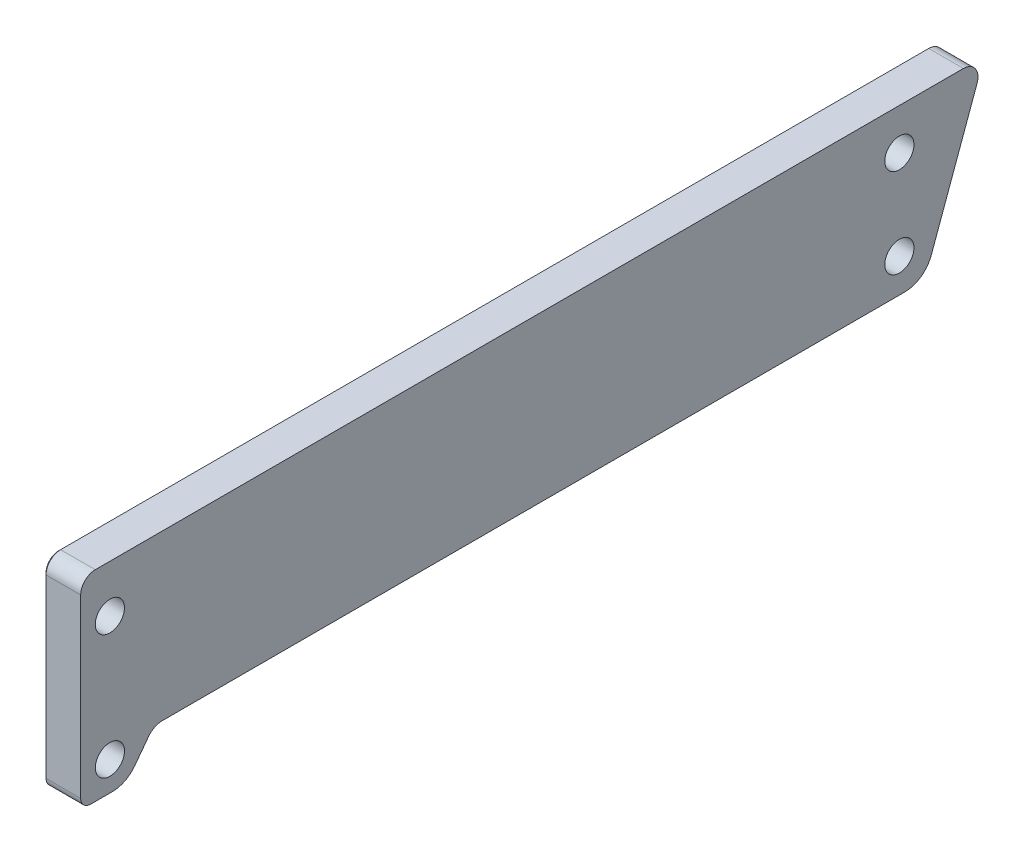
ISO-10303-21;
HEADER;
FILE_DESCRIPTION(('STEP AP214'),'2;1');
FILE_NAME('part.step','',(''),(''),'','','');
FILE_SCHEMA(('AUTOMOTIVE_DESIGN { 1 0 10303 214 1 1 1 1 }'));
ENDSEC;
DATA;
#1=APPLICATION_CONTEXT('core data for automotive mechanical design processes');
#2=APPLICATION_PROTOCOL_DEFINITION('international standard','automotive_design',2000,#1);
#3=PRODUCT_CONTEXT('',#1,'mechanical');
#4=PRODUCT('Part','Part','',(#3));
#5=PRODUCT_RELATED_PRODUCT_CATEGORY('part','',(#4));
#6=PRODUCT_DEFINITION_FORMATION('','',#4);
#7=PRODUCT_DEFINITION_CONTEXT('part definition',#1,'design');
#8=PRODUCT_DEFINITION('design','',#6,#7);
#9=PRODUCT_DEFINITION_SHAPE('','',#8);
#10=(LENGTH_UNIT() NAMED_UNIT(*) SI_UNIT(.MILLI.,.METRE.));
#11=(NAMED_UNIT(*) PLANE_ANGLE_UNIT() SI_UNIT($,.RADIAN.));
#12=(NAMED_UNIT(*) SI_UNIT($,.STERADIAN.) SOLID_ANGLE_UNIT());
#13=UNCERTAINTY_MEASURE_WITH_UNIT(LENGTH_MEASURE(1.E-05),#10,'distance_accuracy_value','');
#14=(GEOMETRIC_REPRESENTATION_CONTEXT(3) GLOBAL_UNCERTAINTY_ASSIGNED_CONTEXT((#13)) GLOBAL_UNIT_ASSIGNED_CONTEXT((#10,
#11,#12)) REPRESENTATION_CONTEXT('',''));
#15=CARTESIAN_POINT('',(0.,0.,0.));
#16=DIRECTION('',(0.,0.,1.));
#17=DIRECTION('',(1.,0.,0.));
#18=AXIS2_PLACEMENT_3D('',#15,#16,#17);
#19=CARTESIAN_POINT('',(2.49567594745314,64.7670130886636,58.028955153829));
#20=DIRECTION('',(-1.,0.,0.));
#21=DIRECTION('',(0.,0.,1.));
#22=AXIS2_PLACEMENT_3D('',#19,#20,#21);
#23=CYLINDRICAL_SURFACE('',#22,2.3);
#24=CARTESIAN_POINT('',(2.49567594745314,64.7670130886636,58.028955153829));
#25=DIRECTION('',(-1.,0.,0.));
#26=DIRECTION('',(0.,0.,1.));
#27=AXIS2_PLACEMENT_3D('',#24,#25,#26);
#28=CIRCLE('',#27,2.3);
#29=CARTESIAN_POINT('',(2.49567594745314,64.7670130886636,60.328955153829));
#30=VERTEX_POINT('',#29);
#31=EDGE_CURVE('E20',#30,#30,#28,.T.);
#32=ORIENTED_EDGE('',*,*,#31,.F.);
#33=EDGE_LOOP('',(#32));
#34=FACE_BOUND('',#33,.T.);
#35=CARTESIAN_POINT('',(1.29567594745314,64.7670130886636,58.028955153829));
#36=DIRECTION('',(-1.,0.,0.));
#37=DIRECTION('',(0.,0.,1.));
#38=AXIS2_PLACEMENT_3D('',#35,#36,#37);
#39=CIRCLE('',#38,2.3);
#40=CARTESIAN_POINT('',(1.29567594745314,64.7670130886636,60.328955153829));
#41=VERTEX_POINT('',#40);
#42=EDGE_CURVE('E119',#41,#41,#39,.F.);
#43=ORIENTED_EDGE('',*,*,#42,.F.);
#44=EDGE_LOOP('',(#43));
#45=FACE_BOUND('',#44,.T.);
#46=ADVANCED_FACE('F17',(#34,#45),#23,.F.);
#47=CARTESIAN_POINT('',(2.49567594745314,64.7670130886636,58.028955153829));
#48=DIRECTION('',(-1.,0.,0.));
#49=DIRECTION('',(0.,0.,1.));
#50=AXIS2_PLACEMENT_3D('',#47,#48,#49);
#51=PLANE('',#50);
#52=CARTESIAN_POINT('',(2.49567594745314,64.7670130886636,58.028955153829));
#53=DIRECTION('',(1.,0.,0.));
#54=DIRECTION('',(0.,0.,-1.));
#55=AXIS2_PLACEMENT_3D('',#52,#53,#54);
#56=CIRCLE('',#55,1.6);
#57=CARTESIAN_POINT('',(2.49567594745314,64.7670130886636,56.428955153829));
#58=VERTEX_POINT('',#57);
#59=EDGE_CURVE('E137',#58,#58,#56,.T.);
#60=ORIENTED_EDGE('',*,*,#59,.T.);
#61=EDGE_LOOP('',(#60));
#62=FACE_BOUND('',#61,.T.);
#63=ORIENTED_EDGE('',*,*,#31,.T.);
#64=EDGE_LOOP('',(#63));
#65=FACE_BOUND('',#64,.T.);
#66=ADVANCED_FACE('F224',(#62,#65),#51,.T.);
#67=CARTESIAN_POINT('',(1.29567594745314,49.3670130886636,138.778955153829));
#68=DIRECTION('',(-1.,0.,0.));
#69=DIRECTION('',(0.,0.,1.));
#70=AXIS2_PLACEMENT_3D('',#67,#68,#69);
#71=PLANE('',#70);
#72=ORIENTED_EDGE('',*,*,#42,.T.);
#73=EDGE_LOOP('',(#72));
#74=FACE_BOUND('',#73,.T.);
#75=CARTESIAN_POINT('',(1.29567594740365,67.6670130886636,146.128955153829));
#76=DIRECTION('',(1.,0.,0.));
#77=DIRECTION('',(0.,0.,-1.));
#78=AXIS2_PLACEMENT_3D('',#75,#76,#77);
#79=CIRCLE('',#78,1.40000000000653);
#80=CARTESIAN_POINT('',(1.29567594743376,69.0670130886442,146.128955153829));
#81=VERTEX_POINT('',#80);
#82=CARTESIAN_POINT('',(1.29567594740365,67.6670130886636,147.528955153837));
#83=VERTEX_POINT('',#82);
#84=EDGE_CURVE('E212',#81,#83,#79,.T.);
#85=ORIENTED_EDGE('',*,*,#84,.F.);
#86=DIRECTION('',(0.,0.,1.));
#87=VECTOR('',#86,1.);
#88=CARTESIAN_POINT('',(1.29567594746387,69.0670130886743,138.778955153829));
#89=LINE('',#88,#87);
#90=CARTESIAN_POINT('',(1.29567594748977,69.0670130886591,51.0139919646164));
#91=VERTEX_POINT('',#90);
#92=EDGE_CURVE('E147',#91,#81,#89,.T.);
#93=ORIENTED_EDGE('',*,*,#92,.F.);
#94=CARTESIAN_POINT('',(1.29567594751734,67.6670130886636,51.0139919646164));
#95=DIRECTION('',(1.,0.,0.));
#96=DIRECTION('',(0.,0.,-1.));
#97=AXIS2_PLACEMENT_3D('',#94,#95,#96);
#98=CIRCLE('',#97,1.40000000000655);
#99=CARTESIAN_POINT('',(1.29567594749468,67.1881848879934,49.6984222954772));
#100=VERTEX_POINT('',#99);
#101=EDGE_CURVE('E210',#100,#91,#98,.T.);
#102=ORIENTED_EDGE('',*,*,#101,.F.);
#103=DIRECTION('',(2.64005216538807E-12,0.939692620785004,-0.342020143328153));
#104=VECTOR('',#103,1.);
#105=CARTESIAN_POINT('',(1.29567594743321,53.3751546730054,54.725954138818));
#106=LINE('',#105,#104);
#107=CARTESIAN_POINT('',(1.29567594744685,53.3751546730095,54.7259541388293));
#108=VERTEX_POINT('',#107);
#109=EDGE_CURVE('E143',#108,#100,#106,.T.);
#110=ORIENTED_EDGE('',*,*,#109,.F.);
#111=CARTESIAN_POINT('',(1.2956759474605,54.3670130886636,57.4510627390708));
#112=DIRECTION('',(1.,0.,0.));
#113=DIRECTION('',(0.,0.,-1.));
#114=AXIS2_PLACEMENT_3D('',#111,#112,#113);
#115=CIRCLE('',#114,2.8999999999559);
#116=CARTESIAN_POINT('',(1.29567594744689,51.4670130886699,57.4510627390709));
#117=VERTEX_POINT('',#116);
#118=EDGE_CURVE('E133',#117,#108,#115,.T.);
#119=ORIENTED_EDGE('',*,*,#118,.F.);
#120=DIRECTION('',(0.,0.,1.));
#121=VECTOR('',#120,1.);
#122=CARTESIAN_POINT('',(1.29567594743328,51.4670130886835,138.778955153829));
#123=LINE('',#122,#121);
#124=CARTESIAN_POINT('',(1.29567594747531,51.4670130886414,138.778955153829));
#125=VERTEX_POINT('',#124);
#126=EDGE_CURVE('E124',#125,#117,#123,.F.);
#127=ORIENTED_EDGE('',*,*,#126,.F.);
#128=CARTESIAN_POINT('',(1.29567594751734,49.3670130886636,138.778955153829));
#129=DIRECTION('',(-1.,0.,0.));
#130=DIRECTION('',(0.,0.,1.));
#131=AXIS2_PLACEMENT_3D('',#128,#129,#130);
#132=CIRCLE('',#131,2.09999999997817);
#133=CARTESIAN_POINT('',(1.29567594748525,50.6270130886853,140.458955153773));
#134=VERTEX_POINT('',#133);
#135=EDGE_CURVE('E107',#125,#134,#132,.F.);
#136=ORIENTED_EDGE('',*,*,#135,.T.);
#137=DIRECTION('',(1.44001130461163E-11,0.799999999991358,-0.600000000011522));
#138=VECTOR('',#137,1.);
#139=CARTESIAN_POINT('',(1.29567594741716,48.6270130886824,141.95895515386));
#140=LINE('',#139,#138);
#141=CARTESIAN_POINT('',(1.29567594742124,48.6270130886686,141.958955153818));
#142=VERTEX_POINT('',#141);
#143=EDGE_CURVE('E160',#142,#134,#140,.T.);
#144=ORIENTED_EDGE('',*,*,#143,.F.);
#145=CARTESIAN_POINT('',(1.29567594751734,50.3670130886636,144.278955153829));
#146=DIRECTION('',(1.,0.,0.));
#147=DIRECTION('',(0.,1.,0.));
#148=AXIS2_PLACEMENT_3D('',#145,#146,#147);
#149=CIRCLE('',#148,2.90000000006141);
#150=CARTESIAN_POINT('',(1.29567594748775,47.467013088629,144.278955153829));
#151=VERTEX_POINT('',#150);
#152=EDGE_CURVE('E216',#151,#142,#149,.T.);
#153=ORIENTED_EDGE('',*,*,#152,.F.);
#154=DIRECTION('',(0.,0.,1.));
#155=VECTOR('',#154,1.);
#156=CARTESIAN_POINT('',(1.29567594745817,47.4670130886586,138.778955153829));
#157=LINE('',#156,#155);
#158=CARTESIAN_POINT('',(1.29567594743149,47.4670130886812,146.628955153829));
#159=VERTEX_POINT('',#158);
#160=EDGE_CURVE('E155',#159,#151,#157,.F.);
#161=ORIENTED_EDGE('',*,*,#160,.F.);
#162=CARTESIAN_POINT('',(1.2956759474605,48.3670130886636,146.628955153829));
#163=DIRECTION('',(1.,0.,0.));
#164=DIRECTION('',(0.,0.,-1.));
#165=AXIS2_PLACEMENT_3D('',#162,#163,#164);
#166=CIRCLE('',#165,0.900000000031376);
#167=CARTESIAN_POINT('',(1.29567594744122,48.3670130886636,147.528955153817));
#168=VERTEX_POINT('',#167);
#169=EDGE_CURVE('E154',#168,#159,#166,.T.);
#170=ORIENTED_EDGE('',*,*,#169,.F.);
#171=DIRECTION('',(0.,1.,0.));
#172=VECTOR('',#171,1.);
#173=CARTESIAN_POINT('',(1.29567594742194,49.3670130886636,147.528955153798));
#174=LINE('',#173,#172);
#175=EDGE_CURVE('E151',#83,#168,#174,.F.);
#176=ORIENTED_EDGE('',*,*,#175,.F.);
#177=EDGE_LOOP('',(#85,#93,#102,#110,#119,#127,#136,#144,#153,#161,#170,#176));
#178=FACE_BOUND('',#177,.T.);
#179=CARTESIAN_POINT('',(1.29567594745314,54.9670130886636,58.028955153829));
#180=DIRECTION('',(1.,0.,0.));
#181=DIRECTION('',(0.,0.,-1.));
#182=AXIS2_PLACEMENT_3D('',#179,#180,#181);
#183=CIRCLE('',#182,1.6);
#184=CARTESIAN_POINT('',(1.29567594745314,54.9670130886636,56.428955153829));
#185=VERTEX_POINT('',#184);
#186=EDGE_CURVE('E204',#185,#185,#183,.T.);
#187=ORIENTED_EDGE('',*,*,#186,.T.);
#188=EDGE_LOOP('',(#187));
#189=FACE_BOUND('',#188,.T.);
#190=CARTESIAN_POINT('',(1.29567594745314,50.4670130886636,144.528955153829));
#191=DIRECTION('',(1.,0.,0.));
#192=DIRECTION('',(0.,0.,-1.));
#193=AXIS2_PLACEMENT_3D('',#190,#191,#192);
#194=CIRCLE('',#193,1.6);
#195=CARTESIAN_POINT('',(1.29567594745314,50.4670130886636,142.928955153829));
#196=VERTEX_POINT('',#195);
#197=EDGE_CURVE('E197',#196,#196,#194,.T.);
#198=ORIENTED_EDGE('',*,*,#197,.T.);
#199=EDGE_LOOP('',(#198));
#200=FACE_BOUND('',#199,.T.);
#201=CARTESIAN_POINT('',(1.29567594745314,64.0670130886636,144.528955153829));
#202=DIRECTION('',(1.,0.,0.));
#203=DIRECTION('',(0.,0.,-1.));
#204=AXIS2_PLACEMENT_3D('',#201,#202,#203);
#205=CIRCLE('',#204,1.6);
#206=CARTESIAN_POINT('',(1.29567594745314,64.0670130886636,142.928955153829));
#207=VERTEX_POINT('',#206);
#208=EDGE_CURVE('E201',#207,#207,#205,.T.);
#209=ORIENTED_EDGE('',*,*,#208,.T.);
#210=EDGE_LOOP('',(#209));
#211=FACE_BOUND('',#210,.T.);
#212=ADVANCED_FACE('F130',(#74,#178,#189,#200,#211),#71,.T.);
#213=CARTESIAN_POINT('',(1.29567594751734,49.3670130886636,138.778955153829));
#214=DIRECTION('',(-1.,0.,0.));
#215=DIRECTION('',(0.,0.,1.));
#216=AXIS2_PLACEMENT_3D('',#213,#214,#215);
#217=CONICAL_SURFACE('',#216,2.09999999997817,0.785398163397448);
#218=DIRECTION('',(0.707106781186554,-0.707106781186541,0.));
#219=VECTOR('',#218,1.);
#220=CARTESIAN_POINT('',(1.29567594745314,51.4670130886636,138.778955153829));
#221=LINE('',#220,#219);
#222=CARTESIAN_POINT('',(1.49567594744883,51.2670130886636,138.778955153829));
#223=VERTEX_POINT('',#222);
#224=EDGE_CURVE('E112',#223,#125,#221,.F.);
#225=ORIENTED_EDGE('',*,*,#224,.F.);
#226=CARTESIAN_POINT('',(1.49567594743583,49.3670130886636,138.778955153829));
#227=DIRECTION('',(1.,0.,0.));
#228=DIRECTION('',(0.,0.,-1.));
#229=AXIS2_PLACEMENT_3D('',#226,#227,#228);
#230=CIRCLE('',#229,1.89999999999999);
#231=CARTESIAN_POINT('',(1.49567594746464,50.5070130886659,140.298955153823));
#232=VERTEX_POINT('',#231);
#233=EDGE_CURVE('E200',#223,#232,#230,.T.);
#234=ORIENTED_EDGE('',*,*,#233,.T.);
#235=DIRECTION('',(0.707106781186549,-0.424264068826513,-0.565685424863298));
#236=VECTOR('',#235,1.);
#237=CARTESIAN_POINT('',(1.29567594745316,50.6270130887045,140.458955153798));
#238=LINE('',#237,#236);
#239=EDGE_CURVE('E115',#134,#232,#238,.T.);
#240=ORIENTED_EDGE('',*,*,#239,.F.);
#241=ORIENTED_EDGE('',*,*,#135,.F.);
#242=EDGE_LOOP('',(#225,#234,#240,#241));
#243=FACE_BOUND('',#242,.T.);
#244=ADVANCED_FACE('F109',(#243),#217,.F.);
#245=CARTESIAN_POINT('',(1.29567594745314,50.6270130886636,140.458955153829));
#246=DIRECTION('',(-0.707106781186541,-0.424264068711934,-0.565685424949242));
#247=DIRECTION('',(-0.62469504755443,0.,0.780868809443026));
#248=AXIS2_PLACEMENT_3D('',#245,#246,#247);
#249=PLANE('',#248);
#250=DIRECTION('',(-0.707106781186548,0.424264068712603,0.565685424948732));
#251=VECTOR('',#250,1.);
#252=CARTESIAN_POINT('',(498854.116720794,-299263.065614295,-398940.297880366));
#253=LINE('',#252,#251);
#254=CARTESIAN_POINT('',(1.49567594746298,48.5070130886696,141.798955153828));
#255=VERTEX_POINT('',#254);
#256=EDGE_CURVE('E162',#142,#255,#253,.F.);
#257=ORIENTED_EDGE('',*,*,#256,.F.);
#258=ORIENTED_EDGE('',*,*,#143,.T.);
#259=ORIENTED_EDGE('',*,*,#239,.T.);
#260=DIRECTION('',(0.,-0.799999999999998,0.600000000000002));
#261=VECTOR('',#260,1.);
#262=CARTESIAN_POINT('',(1.49567594747846,50.5070130886636,140.298955153829));
#263=LINE('',#262,#261);
#264=EDGE_CURVE('E407',#232,#255,#263,.T.);
#265=ORIENTED_EDGE('',*,*,#264,.T.);
#266=EDGE_LOOP('',(#257,#258,#259,#265));
#267=FACE_BOUND('',#266,.T.);
#268=ADVANCED_FACE('F414',(#267),#249,.T.);
#269=CARTESIAN_POINT('',(1.49567594752398,50.3670130886636,144.278955153829));
#270=DIRECTION('',(1.,0.,0.));
#271=DIRECTION('',(0.,1.,0.));
#272=AXIS2_PLACEMENT_3D('',#269,#270,#271);
#273=CONICAL_SURFACE('',#272,3.10000000006805,0.785398163397448);
#274=DIRECTION('',(0.707106781186554,-0.707106781186541,0.));
#275=VECTOR('',#274,1.);
#276=CARTESIAN_POINT('',(1.29567594745314,47.4670130886636,144.278955153829));
#277=LINE('',#276,#275);
#278=CARTESIAN_POINT('',(1.49567594745316,47.2670130886636,144.278955153829));
#279=VERTEX_POINT('',#278);
#280=EDGE_CURVE('E159',#151,#279,#277,.T.);
#281=ORIENTED_EDGE('',*,*,#280,.F.);
#282=ORIENTED_EDGE('',*,*,#152,.T.);
#283=ORIENTED_EDGE('',*,*,#256,.T.);
#284=CARTESIAN_POINT('',(1.49567594745316,50.3670130886636,144.278955153829));
#285=DIRECTION('',(1.,0.,0.));
#286=DIRECTION('',(0.,0.,-1.));
#287=AXIS2_PLACEMENT_3D('',#284,#285,#286);
#288=CIRCLE('',#287,3.10000000000001);
#289=EDGE_CURVE('E397',#279,#255,#288,.T.);
#290=ORIENTED_EDGE('',*,*,#289,.F.);
#291=EDGE_LOOP('',(#281,#282,#283,#290));
#292=FACE_BOUND('',#291,.T.);
#293=ADVANCED_FACE('F522',(#292),#273,.T.);
#294=CARTESIAN_POINT('',(1.29567594745314,47.4670130886636,138.778955153829));
#295=DIRECTION('',(-0.707106781186541,-0.707106781186554,0.));
#296=DIRECTION('',(0.707106781186554,-0.707106781186541,0.));
#297=AXIS2_PLACEMENT_3D('',#294,#295,#296);
#298=PLANE('',#297);
#299=DIRECTION('',(-0.707106781186548,0.707106781186548,0.));
#300=VECTOR('',#299,1.);
#301=CARTESIAN_POINT('',(498952.028662859,-498903.265973823,146.62895515389));
#302=LINE('',#301,#300);
#303=CARTESIAN_POINT('',(1.49567594742823,47.2670130886832,146.628955153829));
#304=VERTEX_POINT('',#303);
#305=EDGE_CURVE('E158',#159,#304,#302,.F.);
#306=ORIENTED_EDGE('',*,*,#305,.F.);
#307=ORIENTED_EDGE('',*,*,#160,.T.);
#308=ORIENTED_EDGE('',*,*,#280,.T.);
#309=DIRECTION('',(0.,0.,1.));
#310=VECTOR('',#309,1.);
#311=CARTESIAN_POINT('',(1.49567594745316,47.2670130886636,144.278955153829));
#312=LINE('',#311,#310);
#313=EDGE_CURVE('E387',#279,#304,#312,.T.);
#314=ORIENTED_EDGE('',*,*,#313,.T.);
#315=EDGE_LOOP('',(#306,#307,#308,#314));
#316=FACE_BOUND('',#315,.T.);
#317=ADVANCED_FACE('F527',(#316),#298,.T.);
#318=CARTESIAN_POINT('',(1.49567594735345,48.3670130886636,146.628955153829));
#319=DIRECTION('',(1.,0.,0.));
#320=DIRECTION('',(0.,0.,-1.));
#321=AXIS2_PLACEMENT_3D('',#318,#319,#320);
#322=CONICAL_SURFACE('',#321,1.09999999992433,0.785398163397448);
#323=DIRECTION('',(0.707106781186559,0.,0.707106781186536));
#324=VECTOR('',#323,1.);
#325=CARTESIAN_POINT('',(1.29567594745314,48.3670130886636,147.528955153829));
#326=LINE('',#325,#324);
#327=CARTESIAN_POINT('',(1.49567594745316,48.3670130886636,147.728955153829));
#328=VERTEX_POINT('',#327);
#329=EDGE_CURVE('E153',#168,#328,#326,.T.);
#330=ORIENTED_EDGE('',*,*,#329,.F.);
#331=ORIENTED_EDGE('',*,*,#169,.T.);
#332=ORIENTED_EDGE('',*,*,#305,.T.);
#333=CARTESIAN_POINT('',(1.49567594745316,48.3670130886636,146.628955153829));
#334=DIRECTION('',(1.,0.,0.));
#335=DIRECTION('',(0.,0.,-1.));
#336=AXIS2_PLACEMENT_3D('',#333,#334,#335);
#337=CIRCLE('',#336,1.1);
#338=EDGE_CURVE('E377',#328,#304,#337,.T.);
#339=ORIENTED_EDGE('',*,*,#338,.F.);
#340=EDGE_LOOP('',(#330,#331,#332,#339));
#341=FACE_BOUND('',#340,.T.);
#342=ADVANCED_FACE('F531',(#341),#322,.T.);
#343=CARTESIAN_POINT('',(1.29567594745314,49.3670130886636,147.528955153829));
#344=DIRECTION('',(-0.707106781186536,0.,0.707106781186559));
#345=DIRECTION('',(0.707106781186559,0.,0.707106781186536));
#346=AXIS2_PLACEMENT_3D('',#343,#344,#345);
#347=PLANE('',#346);
#348=ORIENTED_EDGE('',*,*,#329,.T.);
#349=DIRECTION('',(0.,1.,0.));
#350=VECTOR('',#349,1.);
#351=CARTESIAN_POINT('',(1.49567594745316,48.3670130886636,147.728955153829));
#352=LINE('',#351,#350);
#353=CARTESIAN_POINT('',(1.49567594745666,67.6670130886636,147.728955153838));
#354=VERTEX_POINT('',#353);
#355=EDGE_CURVE('E367',#328,#354,#352,.T.);
#356=ORIENTED_EDGE('',*,*,#355,.T.);
#357=DIRECTION('',(-0.707106781287033,0.,-0.707106781086062));
#358=VECTOR('',#357,1.);
#359=CARTESIAN_POINT('',(498932.228804663,67.6670130886941,499078.461942065));
#360=LINE('',#359,#358);
#361=EDGE_CURVE('E150',#83,#354,#360,.F.);
#362=ORIENTED_EDGE('',*,*,#361,.F.);
#363=ORIENTED_EDGE('',*,*,#175,.T.);
#364=EDGE_LOOP('',(#348,#356,#362,#363));
#365=FACE_BOUND('',#364,.T.);
#366=ADVANCED_FACE('F538',(#365),#347,.T.);
#367=CARTESIAN_POINT('',(1.49567594758082,67.6670130886636,146.128955153829));
#368=DIRECTION('',(1.,0.,0.));
#369=DIRECTION('',(0.,0.,-1.));
#370=AXIS2_PLACEMENT_3D('',#367,#368,#369);
#371=CONICAL_SURFACE('',#370,1.60000000007002,0.785398163113231);
#372=ORIENTED_EDGE('',*,*,#361,.T.);
#373=CARTESIAN_POINT('',(1.49567594745316,67.6670130886636,146.128955153829));
#374=DIRECTION('',(1.,0.,0.));
#375=DIRECTION('',(0.,0.,-1.));
#376=AXIS2_PLACEMENT_3D('',#373,#374,#375);
#377=CIRCLE('',#376,1.6);
#378=CARTESIAN_POINT('',(1.49567594745316,69.2670130886636,146.128955153829));
#379=VERTEX_POINT('',#378);
#380=EDGE_CURVE('E357',#379,#354,#377,.T.);
#381=ORIENTED_EDGE('',*,*,#380,.F.);
#382=DIRECTION('',(-0.707106781186555,-0.70710678118654,0.));
#383=VECTOR('',#382,1.);
#384=CARTESIAN_POINT('',(1.29567594745314,69.0670130886636,146.128955153829));
#385=LINE('',#384,#383);
#386=EDGE_CURVE('E149',#81,#379,#385,.F.);
#387=ORIENTED_EDGE('',*,*,#386,.F.);
#388=ORIENTED_EDGE('',*,*,#84,.T.);
#389=EDGE_LOOP('',(#372,#381,#387,#388));
#390=FACE_BOUND('',#389,.T.);
#391=ADVANCED_FACE('F541',(#390),#371,.T.);
#392=CARTESIAN_POINT('',(1.29567594745314,69.0670130886636,138.778955153829));
#393=DIRECTION('',(-0.70710678118654,0.707106781186555,0.));
#394=DIRECTION('',(-0.707106781186555,-0.70710678118654,0.));
#395=AXIS2_PLACEMENT_3D('',#392,#393,#394);
#396=PLANE('',#395);
#397=ORIENTED_EDGE('',*,*,#386,.T.);
#398=DIRECTION('',(0.,0.,-1.));
#399=VECTOR('',#398,1.);
#400=CARTESIAN_POINT('',(1.49567594745316,69.2670130886636,146.128955153829));
#401=LINE('',#400,#399);
#402=CARTESIAN_POINT('',(1.49567594745666,69.2670130886527,51.0139919646164));
#403=VERTEX_POINT('',#402);
#404=EDGE_CURVE('E347',#379,#403,#401,.T.);
#405=ORIENTED_EDGE('',*,*,#404,.T.);
#406=DIRECTION('',(-0.707106781186548,-0.707106781186548,0.));
#407=VECTOR('',#406,1.);
#408=CARTESIAN_POINT('',(498932.228662859,499000.,51.0139919646164));
#409=LINE('',#408,#407);
#410=EDGE_CURVE('E146',#91,#403,#409,.F.);
#411=ORIENTED_EDGE('',*,*,#410,.F.);
#412=ORIENTED_EDGE('',*,*,#92,.T.);
#413=EDGE_LOOP('',(#397,#405,#411,#412));
#414=FACE_BOUND('',#413,.T.);
#415=ADVANCED_FACE('F543',(#414),#396,.T.);
#416=CARTESIAN_POINT('',(1.49567594741029,67.6670130886636,51.0139919646164));
#417=DIRECTION('',(1.,0.,0.));
#418=DIRECTION('',(0.,0.,-1.));
#419=AXIS2_PLACEMENT_3D('',#416,#417,#418);
#420=CONICAL_SURFACE('',#419,1.5999999998995,0.785398163397448);
#421=ORIENTED_EDGE('',*,*,#410,.T.);
#422=CARTESIAN_POINT('',(1.49567594745316,67.6670130886636,51.0139919646164));
#423=DIRECTION('',(1.,0.,0.));
#424=DIRECTION('',(0.,0.,-1.));
#425=AXIS2_PLACEMENT_3D('',#422,#423,#424);
#426=CIRCLE('',#425,1.6);
#427=CARTESIAN_POINT('',(1.49567594745316,67.1197808593425,49.510483771359));
#428=VERTEX_POINT('',#427);
#429=EDGE_CURVE('E337',#428,#403,#426,.T.);
#430=ORIENTED_EDGE('',*,*,#429,.F.);
#431=DIRECTION('',(0.707106781186555,-0.241844762647964,-0.66446302438867));
#432=VECTOR('',#431,1.);
#433=CARTESIAN_POINT('',(1.29567594747202,67.1881848880012,49.6984222954985));
#434=LINE('',#433,#432);
#435=EDGE_CURVE('E145',#100,#428,#434,.T.);
#436=ORIENTED_EDGE('',*,*,#435,.F.);
#437=ORIENTED_EDGE('',*,*,#101,.T.);
#438=EDGE_LOOP('',(#421,#430,#436,#437));
#439=FACE_BOUND('',#438,.T.);
#440=ADVANCED_FACE('F547',(#439),#420,.T.);
#441=CARTESIAN_POINT('',(1.29567594745314,22.8217627821583,65.8464793429356));
#442=DIRECTION('',(-0.707106781186547,-0.241844762647978,-0.664463024388674));
#443=DIRECTION('',(-0.684791078771736,0.,0.728739444818683));
#444=AXIS2_PLACEMENT_3D('',#441,#442,#443);
#445=PLANE('',#444);
#446=ORIENTED_EDGE('',*,*,#435,.T.);
#447=DIRECTION('',(0.,-0.939692620785907,0.342020143325672));
#448=VECTOR('',#447,1.);
#449=CARTESIAN_POINT('',(1.49567594745316,67.1197808593425,49.510483771359));
#450=LINE('',#449,#448);
#451=CARTESIAN_POINT('',(1.49567594747087,53.3067506443519,54.5380156146453));
#452=VERTEX_POINT('',#451);
#453=EDGE_CURVE('E321',#428,#452,#450,.T.);
#454=ORIENTED_EDGE('',*,*,#453,.T.);
#455=CARTESIAN_POINT('',(1.2956759474605,53.3751546730136,54.7259541388406));
#456=CARTESIAN_POINT('',(1.30400928082132,53.3723045051705,54.7181233670481));
#457=CARTESIAN_POINT('',(1.31234261414251,53.3694543373138,54.7102925952183));
#458=CARTESIAN_POINT('',(1.32900928080383,53.363754001581,54.6946310515054));
#459=CARTESIAN_POINT('',(1.33734261414397,53.3609038337049,54.6868002796222));
#460=CARTESIAN_POINT('',(1.35400928080876,53.3552034979862,54.6711387359481));
#461=CARTESIAN_POINT('',(1.36234261413343,53.3523533301437,54.6633079641572));
#462=CARTESIAN_POINT('',(1.37900928079728,53.3466529944312,54.6476464205));
#463=CARTESIAN_POINT('',(1.38734261413647,53.3438028265613,54.6398156486337));
#464=CARTESIAN_POINT('',(1.40400928085748,53.3381024908295,54.6241541049234));
#465=CARTESIAN_POINT('',(1.4123426142393,53.3352523229677,54.6163233330793));
#466=CARTESIAN_POINT('',(1.42900928090315,53.3295519872488,54.6006617894043));
#467=CARTESIAN_POINT('',(1.43734261418518,53.3267018193917,54.5928310175733));
#468=CARTESIAN_POINT('',(1.45400928082156,53.3210014836699,54.5771694738903));
#469=CARTESIAN_POINT('',(1.46234261417591,53.3181513158052,54.5693387020382));
#470=CARTESIAN_POINT('',(1.47900928086565,53.3124509800822,54.5536771583519));
#471=CARTESIAN_POINT('',(1.48734261420105,53.309600812224,54.5458463865177));
#472=CARTESIAN_POINT('',(1.49567594752398,53.3067506443615,54.5380156146717));
#473=B_SPLINE_CURVE_WITH_KNOTS('',3,(#455,#456,#457,#458,#459,#460,#461,#462,#463,#464,#465,
#466,#467,#468,#469,#470,#471,#472),.UNSPECIFIED.,.F.,.F.,(4,2,2,2,2,2,2,2,4),(0.,
0.0353553390102549,0.0707106781812913,0.106066017111159,0.141421356242002,0.176776695413036,
0.212132034342908,0.247487373473749,0.282842712524203),.UNSPECIFIED.);
#474=EDGE_CURVE('E127',#108,#452,#473,.T.);
#475=ORIENTED_EDGE('',*,*,#474,.F.);
#476=ORIENTED_EDGE('',*,*,#109,.T.);
#477=EDGE_LOOP('',(#446,#454,#475,#476));
#478=FACE_BOUND('',#477,.T.);
#479=ADVANCED_FACE('F549',(#478),#445,.T.);
#480=CARTESIAN_POINT('',(1.49567594752398,54.3670130886636,57.4510627390708));
#481=DIRECTION('',(1.,0.,0.));
#482=DIRECTION('',(0.,0.,-1.));
#483=AXIS2_PLACEMENT_3D('',#480,#481,#482);
#484=CONICAL_SURFACE('',#483,3.09999999996254,0.78539816325534);
#485=ORIENTED_EDGE('',*,*,#474,.T.);
#486=CARTESIAN_POINT('',(1.49567594745316,54.3670130886636,57.4510627390708));
#487=DIRECTION('',(1.,0.,0.));
#488=DIRECTION('',(0.,0.,-1.));
#489=AXIS2_PLACEMENT_3D('',#486,#487,#488);
#490=CIRCLE('',#489,3.1);
#491=CARTESIAN_POINT('',(1.49567594745316,51.2670130886636,57.4510627390709));
#492=VERTEX_POINT('',#491);
#493=EDGE_CURVE('E432',#492,#452,#490,.T.);
#494=ORIENTED_EDGE('',*,*,#493,.F.);
#495=DIRECTION('',(0.707106781186554,-0.707106781186541,0.));
#496=VECTOR('',#495,1.);
#497=CARTESIAN_POINT('',(1.29567594745314,51.4670130886636,57.4510627390709));
#498=LINE('',#497,#496);
#499=EDGE_CURVE('E135',#117,#492,#498,.T.);
#500=ORIENTED_EDGE('',*,*,#499,.F.);
#501=ORIENTED_EDGE('',*,*,#118,.T.);
#502=EDGE_LOOP('',(#485,#494,#500,#501));
#503=FACE_BOUND('',#502,.T.);
#504=ADVANCED_FACE('F307',(#503),#484,.T.);
#505=CARTESIAN_POINT('',(1.29567594745314,51.4670130886636,138.778955153829));
#506=DIRECTION('',(-0.707106781186541,-0.707106781186554,0.));
#507=DIRECTION('',(0.707106781186554,-0.707106781186541,0.));
#508=AXIS2_PLACEMENT_3D('',#505,#506,#507);
#509=PLANE('',#508);
#510=ORIENTED_EDGE('',*,*,#499,.T.);
#511=DIRECTION('',(0.,0.,1.));
#512=VECTOR('',#511,1.);
#513=CARTESIAN_POINT('',(1.49567594745316,51.2670130886636,57.4510627390708));
#514=LINE('',#513,#512);
#515=EDGE_CURVE('E126',#492,#223,#514,.T.);
#516=ORIENTED_EDGE('',*,*,#515,.T.);
#517=ORIENTED_EDGE('',*,*,#224,.T.);
#518=ORIENTED_EDGE('',*,*,#126,.T.);
#519=EDGE_LOOP('',(#510,#516,#517,#518));
#520=FACE_BOUND('',#519,.T.);
#521=ADVANCED_FACE('F123',(#520),#509,.T.);
#522=CARTESIAN_POINT('',(1.29567594745314,64.7670130886636,58.028955153829));
#523=DIRECTION('',(1.,0.,0.));
#524=DIRECTION('',(0.,0.,-1.));
#525=AXIS2_PLACEMENT_3D('',#522,#523,#524);
#526=CYLINDRICAL_SURFACE('',#525,1.6);
#527=ORIENTED_EDGE('',*,*,#59,.F.);
#528=EDGE_LOOP('',(#527));
#529=FACE_BOUND('',#528,.T.);
#530=CARTESIAN_POINT('',(5.29567594745314,64.7670130886636,58.028955153829));
#531=DIRECTION('',(1.,0.,0.));
#532=DIRECTION('',(0.,0.,-1.));
#533=AXIS2_PLACEMENT_3D('',#530,#531,#532);
#534=CIRCLE('',#533,1.6);
#535=CARTESIAN_POINT('',(5.29567594745314,64.7670130886636,56.428955153829));
#536=VERTEX_POINT('',#535);
#537=EDGE_CURVE('E194',#536,#536,#534,.T.);
#538=ORIENTED_EDGE('',*,*,#537,.T.);
#539=EDGE_LOOP('',(#538));
#540=FACE_BOUND('',#539,.T.);
#541=ADVANCED_FACE('F300',(#529,#540),#526,.F.);
#542=CARTESIAN_POINT('',(1.29567594745314,54.9670130886636,58.028955153829));
#543=DIRECTION('',(1.,0.,0.));
#544=DIRECTION('',(0.,0.,-1.));
#545=AXIS2_PLACEMENT_3D('',#542,#543,#544);
#546=CYLINDRICAL_SURFACE('',#545,1.6);
#547=ORIENTED_EDGE('',*,*,#186,.F.);
#548=EDGE_LOOP('',(#547));
#549=FACE_BOUND('',#548,.T.);
#550=CARTESIAN_POINT('',(5.29567594745314,54.9670130886636,58.028955153829));
#551=DIRECTION('',(1.,0.,0.));
#552=DIRECTION('',(0.,0.,-1.));
#553=AXIS2_PLACEMENT_3D('',#550,#551,#552);
#554=CIRCLE('',#553,1.6);
#555=CARTESIAN_POINT('',(5.29567594745314,54.9670130886636,56.428955153829));
#556=VERTEX_POINT('',#555);
#557=EDGE_CURVE('E191',#556,#556,#554,.T.);
#558=ORIENTED_EDGE('',*,*,#557,.T.);
#559=EDGE_LOOP('',(#558));
#560=FACE_BOUND('',#559,.T.);
#561=ADVANCED_FACE('F296',(#549,#560),#546,.F.);
#562=CARTESIAN_POINT('',(1.29567594745314,64.0670130886636,144.528955153829));
#563=DIRECTION('',(1.,0.,0.));
#564=DIRECTION('',(0.,0.,-1.));
#565=AXIS2_PLACEMENT_3D('',#562,#563,#564);
#566=CYLINDRICAL_SURFACE('',#565,1.6);
#567=ORIENTED_EDGE('',*,*,#208,.F.);
#568=EDGE_LOOP('',(#567));
#569=FACE_BOUND('',#568,.T.);
#570=CARTESIAN_POINT('',(5.29567594745314,64.0670130886636,144.528955153829));
#571=DIRECTION('',(1.,0.,0.));
#572=DIRECTION('',(0.,0.,-1.));
#573=AXIS2_PLACEMENT_3D('',#570,#571,#572);
#574=CIRCLE('',#573,1.6);
#575=CARTESIAN_POINT('',(5.29567594745314,64.0670130886636,142.928955153829));
#576=VERTEX_POINT('',#575);
#577=EDGE_CURVE('E188',#576,#576,#574,.T.);
#578=ORIENTED_EDGE('',*,*,#577,.T.);
#579=EDGE_LOOP('',(#578));
#580=FACE_BOUND('',#579,.T.);
#581=ADVANCED_FACE('F292',(#569,#580),#566,.F.);
#582=CARTESIAN_POINT('',(1.29567594745314,50.4670130886636,144.528955153829));
#583=DIRECTION('',(1.,0.,0.));
#584=DIRECTION('',(0.,0.,-1.));
#585=AXIS2_PLACEMENT_3D('',#582,#583,#584);
#586=CYLINDRICAL_SURFACE('',#585,1.6);
#587=ORIENTED_EDGE('',*,*,#197,.F.);
#588=EDGE_LOOP('',(#587));
#589=FACE_BOUND('',#588,.T.);
#590=CARTESIAN_POINT('',(5.29567594745314,50.4670130886636,144.528955153829));
#591=DIRECTION('',(1.,0.,0.));
#592=DIRECTION('',(0.,0.,-1.));
#593=AXIS2_PLACEMENT_3D('',#590,#591,#592);
#594=CIRCLE('',#593,1.6);
#595=CARTESIAN_POINT('',(5.29567594745314,50.4670130886636,142.928955153829));
#596=VERTEX_POINT('',#595);
#597=EDGE_CURVE('E185',#596,#596,#594,.T.);
#598=ORIENTED_EDGE('',*,*,#597,.T.);
#599=EDGE_LOOP('',(#598));
#600=FACE_BOUND('',#599,.T.);
#601=ADVANCED_FACE('F288',(#589,#600),#586,.F.);
#602=CARTESIAN_POINT('',(1.29567594745314,49.3670130886636,138.778955153829));
#603=DIRECTION('',(1.,0.,0.));
#604=DIRECTION('',(0.,0.,-1.));
#605=AXIS2_PLACEMENT_3D('',#602,#603,#604);
#606=CYLINDRICAL_SURFACE('',#605,1.89999999999999);
#607=DIRECTION('',(1.,0.,0.));
#608=VECTOR('',#607,1.);
#609=CARTESIAN_POINT('',(1.29567594745314,51.2670130886636,138.778955153829));
#610=LINE('',#609,#608);
#611=CARTESIAN_POINT('',(5.29567594745314,51.2670130886636,138.778955153829));
#612=VERTEX_POINT('',#611);
#613=EDGE_CURVE('E435',#223,#612,#610,.T.);
#614=ORIENTED_EDGE('',*,*,#613,.T.);
#615=CARTESIAN_POINT('',(5.29567594745314,49.3670130886636,138.778955153829));
#616=DIRECTION('',(1.,0.,0.));
#617=DIRECTION('',(0.,0.,-1.));
#618=AXIS2_PLACEMENT_3D('',#615,#616,#617);
#619=CIRCLE('',#618,1.89999999999999);
#620=CARTESIAN_POINT('',(5.29567594745314,50.5070130886636,140.298955153829));
#621=VERTEX_POINT('',#620);
#622=EDGE_CURVE('E182',#612,#621,#619,.T.);
#623=ORIENTED_EDGE('',*,*,#622,.T.);
#624=DIRECTION('',(1.,0.,0.));
#625=VECTOR('',#624,1.);
#626=CARTESIAN_POINT('',(1.29567594745314,50.5070130886636,140.298955153829));
#627=LINE('',#626,#625);
#628=EDGE_CURVE('E410',#621,#232,#627,.F.);
#629=ORIENTED_EDGE('',*,*,#628,.T.);
#630=ORIENTED_EDGE('',*,*,#233,.F.);
#631=EDGE_LOOP('',(#614,#623,#629,#630));
#632=FACE_BOUND('',#631,.T.);
#633=ADVANCED_FACE('F284',(#632),#606,.F.);
#634=CARTESIAN_POINT('',(1.29567594745314,50.5070130886636,140.298955153829));
#635=DIRECTION('',(0.,0.600000000000002,0.799999999999998));
#636=DIRECTION('',(0.,-0.799999999999998,0.600000000000002));
#637=AXIS2_PLACEMENT_3D('',#634,#635,#636);
#638=PLANE('',#637);
#639=ORIENTED_EDGE('',*,*,#628,.F.);
#640=DIRECTION('',(0.,-0.799999999999999,0.600000000000001));
#641=VECTOR('',#640,1.);
#642=CARTESIAN_POINT('',(5.29567594745314,50.5070130886636,140.298955153829));
#643=LINE('',#642,#641);
#644=CARTESIAN_POINT('',(5.29567594745314,48.5070130886647,141.798955153828));
#645=VERTEX_POINT('',#644);
#646=EDGE_CURVE('E181',#621,#645,#643,.T.);
#647=ORIENTED_EDGE('',*,*,#646,.T.);
#648=DIRECTION('',(1.,0.,0.));
#649=VECTOR('',#648,1.);
#650=CARTESIAN_POINT('',(1.29567594745314,48.5070130886658,141.798955153827));
#651=LINE('',#650,#649);
#652=EDGE_CURVE('E400',#255,#645,#651,.T.);
#653=ORIENTED_EDGE('',*,*,#652,.F.);
#654=ORIENTED_EDGE('',*,*,#264,.F.);
#655=EDGE_LOOP('',(#639,#647,#653,#654));
#656=FACE_BOUND('',#655,.T.);
#657=ADVANCED_FACE('F280',(#656),#638,.F.);
#658=CARTESIAN_POINT('',(1.29567594745314,50.3670130886636,144.278955153829));
#659=DIRECTION('',(1.,0.,0.));
#660=DIRECTION('',(0.,0.,-1.));
#661=AXIS2_PLACEMENT_3D('',#658,#659,#660);
#662=CYLINDRICAL_SURFACE('',#661,3.10000000000001);
#663=DIRECTION('',(1.,0.,0.));
#664=VECTOR('',#663,1.);
#665=CARTESIAN_POINT('',(1.29567594745314,47.2670130886636,144.278955153829));
#666=LINE('',#665,#664);
#667=CARTESIAN_POINT('',(5.29567594745314,47.2670130886636,144.278955153829));
#668=VERTEX_POINT('',#667);
#669=EDGE_CURVE('E390',#668,#279,#666,.F.);
#670=ORIENTED_EDGE('',*,*,#669,.T.);
#671=ORIENTED_EDGE('',*,*,#289,.T.);
#672=ORIENTED_EDGE('',*,*,#652,.T.);
#673=CARTESIAN_POINT('',(5.29567594745314,50.3670130886636,144.278955153829));
#674=DIRECTION('',(1.,0.,0.));
#675=DIRECTION('',(0.,0.,-1.));
#676=AXIS2_PLACEMENT_3D('',#673,#674,#675);
#677=CIRCLE('',#676,3.10000000000001);
#678=EDGE_CURVE('E178',#645,#668,#677,.F.);
#679=ORIENTED_EDGE('',*,*,#678,.T.);
#680=EDGE_LOOP('',(#670,#671,#672,#679));
#681=FACE_BOUND('',#680,.T.);
#682=ADVANCED_FACE('F276',(#681),#662,.T.);
#683=CARTESIAN_POINT('',(1.29567594745314,47.2670130886636,144.278955153829));
#684=DIRECTION('',(0.,1.,0.));
#685=DIRECTION('',(0.,0.,1.));
#686=AXIS2_PLACEMENT_3D('',#683,#684,#685);
#687=PLANE('',#686);
#688=ORIENTED_EDGE('',*,*,#669,.F.);
#689=DIRECTION('',(0.,0.,1.));
#690=VECTOR('',#689,1.);
#691=CARTESIAN_POINT('',(5.29567594745314,47.2670130886636,138.778955153829));
#692=LINE('',#691,#690);
#693=CARTESIAN_POINT('',(5.29567594745314,47.2670130886636,146.628955153829));
#694=VERTEX_POINT('',#693);
#695=EDGE_CURVE('E177',#668,#694,#692,.T.);
#696=ORIENTED_EDGE('',*,*,#695,.T.);
#697=DIRECTION('',(1.,0.,0.));
#698=VECTOR('',#697,1.);
#699=CARTESIAN_POINT('',(1.29567594745314,47.2670130886636,146.628955153829));
#700=LINE('',#699,#698);
#701=EDGE_CURVE('E380',#304,#694,#700,.T.);
#702=ORIENTED_EDGE('',*,*,#701,.F.);
#703=ORIENTED_EDGE('',*,*,#313,.F.);
#704=EDGE_LOOP('',(#688,#696,#702,#703));
#705=FACE_BOUND('',#704,.T.);
#706=ADVANCED_FACE('F272',(#705),#687,.F.);
#707=CARTESIAN_POINT('',(1.29567594745314,48.3670130886636,146.628955153829));
#708=DIRECTION('',(1.,0.,0.));
#709=DIRECTION('',(0.,0.,-1.));
#710=AXIS2_PLACEMENT_3D('',#707,#708,#709);
#711=CYLINDRICAL_SURFACE('',#710,1.1);
#712=DIRECTION('',(1.,0.,0.));
#713=VECTOR('',#712,1.);
#714=CARTESIAN_POINT('',(1.29567594745314,48.3670130886636,147.728955153829));
#715=LINE('',#714,#713);
#716=CARTESIAN_POINT('',(5.29567594745314,48.3670130886636,147.728955153829));
#717=VERTEX_POINT('',#716);
#718=EDGE_CURVE('E370',#717,#328,#715,.F.);
#719=ORIENTED_EDGE('',*,*,#718,.T.);
#720=ORIENTED_EDGE('',*,*,#338,.T.);
#721=ORIENTED_EDGE('',*,*,#701,.T.);
#722=CARTESIAN_POINT('',(5.29567594745314,48.3670130886636,146.628955153829));
#723=DIRECTION('',(1.,0.,0.));
#724=DIRECTION('',(0.,0.,-1.));
#725=AXIS2_PLACEMENT_3D('',#722,#723,#724);
#726=CIRCLE('',#725,1.1);
#727=EDGE_CURVE('E174',#694,#717,#726,.F.);
#728=ORIENTED_EDGE('',*,*,#727,.T.);
#729=EDGE_LOOP('',(#719,#720,#721,#728));
#730=FACE_BOUND('',#729,.T.);
#731=ADVANCED_FACE('F268',(#730),#711,.T.);
#732=CARTESIAN_POINT('',(1.29567594745314,48.3670130886636,147.728955153829));
#733=DIRECTION('',(0.,0.,-1.));
#734=DIRECTION('',(0.,1.,0.));
#735=AXIS2_PLACEMENT_3D('',#732,#733,#734);
#736=PLANE('',#735);
#737=ORIENTED_EDGE('',*,*,#718,.F.);
#738=DIRECTION('',(0.,1.,0.));
#739=VECTOR('',#738,1.);
#740=CARTESIAN_POINT('',(5.29567594745314,49.3670130886636,147.728955153829));
#741=LINE('',#740,#739);
#742=CARTESIAN_POINT('',(5.29567594745314,67.6670130886636,147.728955153829));
#743=VERTEX_POINT('',#742);
#744=EDGE_CURVE('E173',#717,#743,#741,.T.);
#745=ORIENTED_EDGE('',*,*,#744,.T.);
#746=DIRECTION('',(1.,0.,0.));
#747=VECTOR('',#746,1.);
#748=CARTESIAN_POINT('',(1.29567594745314,67.6670130886636,147.728955153829));
#749=LINE('',#748,#747);
#750=EDGE_CURVE('E360',#354,#743,#749,.T.);
#751=ORIENTED_EDGE('',*,*,#750,.F.);
#752=ORIENTED_EDGE('',*,*,#355,.F.);
#753=EDGE_LOOP('',(#737,#745,#751,#752));
#754=FACE_BOUND('',#753,.T.);
#755=ADVANCED_FACE('F264',(#754),#736,.F.);
#756=CARTESIAN_POINT('',(1.29567594745314,67.6670130886636,146.128955153829));
#757=DIRECTION('',(1.,0.,0.));
#758=DIRECTION('',(0.,0.,-1.));
#759=AXIS2_PLACEMENT_3D('',#756,#757,#758);
#760=CYLINDRICAL_SURFACE('',#759,1.6);
#761=DIRECTION('',(1.,0.,0.));
#762=VECTOR('',#761,1.);
#763=CARTESIAN_POINT('',(1.29567594745314,69.2670130886636,146.128955153829));
#764=LINE('',#763,#762);
#765=CARTESIAN_POINT('',(5.29567594745314,69.2670130886636,146.128955153829));
#766=VERTEX_POINT('',#765);
#767=EDGE_CURVE('E350',#766,#379,#764,.F.);
#768=ORIENTED_EDGE('',*,*,#767,.T.);
#769=ORIENTED_EDGE('',*,*,#380,.T.);
#770=ORIENTED_EDGE('',*,*,#750,.T.);
#771=CARTESIAN_POINT('',(5.29567594745314,67.6670130886636,146.128955153829));
#772=DIRECTION('',(1.,0.,0.));
#773=DIRECTION('',(0.,0.,-1.));
#774=AXIS2_PLACEMENT_3D('',#771,#772,#773);
#775=CIRCLE('',#774,1.6);
#776=EDGE_CURVE('E170',#743,#766,#775,.F.);
#777=ORIENTED_EDGE('',*,*,#776,.T.);
#778=EDGE_LOOP('',(#768,#769,#770,#777));
#779=FACE_BOUND('',#778,.T.);
#780=ADVANCED_FACE('F260',(#779),#760,.T.);
#781=CARTESIAN_POINT('',(1.29567594745314,69.2670130886636,146.128955153829));
#782=DIRECTION('',(0.,-1.,0.));
#783=DIRECTION('',(0.,0.,-1.));
#784=AXIS2_PLACEMENT_3D('',#781,#782,#783);
#785=PLANE('',#784);
#786=ORIENTED_EDGE('',*,*,#767,.F.);
#787=DIRECTION('',(0.,0.,1.));
#788=VECTOR('',#787,1.);
#789=CARTESIAN_POINT('',(5.29567594745314,69.2670130886636,138.778955153829));
#790=LINE('',#789,#788);
#791=CARTESIAN_POINT('',(5.29567594745314,69.2670130886636,51.0139919646164));
#792=VERTEX_POINT('',#791);
#793=EDGE_CURVE('E169',#766,#792,#790,.F.);
#794=ORIENTED_EDGE('',*,*,#793,.T.);
#795=DIRECTION('',(1.,0.,0.));
#796=VECTOR('',#795,1.);
#797=CARTESIAN_POINT('',(1.29567594745314,69.2670130886636,51.0139919646164));
#798=LINE('',#797,#796);
#799=EDGE_CURVE('E340',#403,#792,#798,.T.);
#800=ORIENTED_EDGE('',*,*,#799,.F.);
#801=ORIENTED_EDGE('',*,*,#404,.F.);
#802=EDGE_LOOP('',(#786,#794,#800,#801));
#803=FACE_BOUND('',#802,.T.);
#804=ADVANCED_FACE('F256',(#803),#785,.F.);
#805=CARTESIAN_POINT('',(1.29567594745314,67.6670130886636,51.0139919646164));
#806=DIRECTION('',(1.,0.,0.));
#807=DIRECTION('',(0.,0.,-1.));
#808=AXIS2_PLACEMENT_3D('',#805,#806,#807);
#809=CYLINDRICAL_SURFACE('',#808,1.6);
#810=DIRECTION('',(1.,0.,0.));
#811=VECTOR('',#810,1.);
#812=CARTESIAN_POINT('',(1.29567594745314,67.1197808593425,49.510483771359));
#813=LINE('',#812,#811);
#814=CARTESIAN_POINT('',(5.29567594745314,67.1197808593425,49.510483771359));
#815=VERTEX_POINT('',#814);
#816=EDGE_CURVE('E330',#815,#428,#813,.F.);
#817=ORIENTED_EDGE('',*,*,#816,.T.);
#818=ORIENTED_EDGE('',*,*,#429,.T.);
#819=ORIENTED_EDGE('',*,*,#799,.T.);
#820=CARTESIAN_POINT('',(5.29567594745314,67.6670130886636,51.0139919646164));
#821=DIRECTION('',(1.,0.,0.));
#822=DIRECTION('',(0.,0.,-1.));
#823=AXIS2_PLACEMENT_3D('',#820,#821,#822);
#824=CIRCLE('',#823,1.6);
#825=EDGE_CURVE('E166',#792,#815,#824,.F.);
#826=ORIENTED_EDGE('',*,*,#825,.T.);
#827=EDGE_LOOP('',(#817,#818,#819,#826));
#828=FACE_BOUND('',#827,.T.);
#829=ADVANCED_FACE('F252',(#828),#809,.T.);
#830=CARTESIAN_POINT('',(1.29567594745314,67.1197808593425,49.510483771359));
#831=DIRECTION('',(0.,0.342020143325672,0.939692620785907));
#832=DIRECTION('',(0.,-0.939692620785907,0.342020143325672));
#833=AXIS2_PLACEMENT_3D('',#830,#831,#832);
#834=PLANE('',#833);
#835=ORIENTED_EDGE('',*,*,#816,.F.);
#836=DIRECTION('',(0.,-0.939692620785907,0.342020143325672));
#837=VECTOR('',#836,1.);
#838=CARTESIAN_POINT('',(5.29567594745314,67.1197808593425,49.510483771359));
#839=LINE('',#838,#837);
#840=CARTESIAN_POINT('',(5.29567594745314,53.3067506443513,54.5380156146355));
#841=VERTEX_POINT('',#840);
#842=EDGE_CURVE('E165',#815,#841,#839,.T.);
#843=ORIENTED_EDGE('',*,*,#842,.T.);
#844=DIRECTION('',(1.,0.,0.));
#845=VECTOR('',#844,1.);
#846=CARTESIAN_POINT('',(1.29567594745314,53.3067506443487,54.5380156146365));
#847=LINE('',#846,#845);
#848=EDGE_CURVE('E329',#452,#841,#847,.T.);
#849=ORIENTED_EDGE('',*,*,#848,.F.);
#850=ORIENTED_EDGE('',*,*,#453,.F.);
#851=EDGE_LOOP('',(#835,#843,#849,#850));
#852=FACE_BOUND('',#851,.T.);
#853=ADVANCED_FACE('F248',(#852),#834,.F.);
#854=CARTESIAN_POINT('',(1.29567594745314,54.3670130886636,57.4510627390708));
#855=DIRECTION('',(1.,0.,0.));
#856=DIRECTION('',(0.,0.,-1.));
#857=AXIS2_PLACEMENT_3D('',#854,#855,#856);
#858=CYLINDRICAL_SURFACE('',#857,3.1);
#859=DIRECTION('',(1.,0.,0.));
#860=VECTOR('',#859,1.);
#861=CARTESIAN_POINT('',(1.29567594745314,51.2670130886636,57.4510627390708));
#862=LINE('',#861,#860);
#863=CARTESIAN_POINT('',(5.29567594745314,51.2670130886636,57.4510627390709));
#864=VERTEX_POINT('',#863);
#865=EDGE_CURVE('E34',#864,#492,#862,.F.);
#866=ORIENTED_EDGE('',*,*,#865,.T.);
#867=ORIENTED_EDGE('',*,*,#493,.T.);
#868=ORIENTED_EDGE('',*,*,#848,.T.);
#869=CARTESIAN_POINT('',(5.29567594745314,54.3670130886636,57.4510627390708));
#870=DIRECTION('',(1.,0.,0.));
#871=DIRECTION('',(0.,0.,-1.));
#872=AXIS2_PLACEMENT_3D('',#869,#870,#871);
#873=CIRCLE('',#872,3.1);
#874=EDGE_CURVE('E26',#841,#864,#873,.F.);
#875=ORIENTED_EDGE('',*,*,#874,.T.);
#876=EDGE_LOOP('',(#866,#867,#868,#875));
#877=FACE_BOUND('',#876,.T.);
#878=ADVANCED_FACE('F241',(#877),#858,.T.);
#879=CARTESIAN_POINT('',(1.29567594745314,51.2670130886636,57.4510627390708));
#880=DIRECTION('',(0.,1.,0.));
#881=DIRECTION('',(0.,0.,1.));
#882=AXIS2_PLACEMENT_3D('',#879,#880,#881);
#883=PLANE('',#882);
#884=ORIENTED_EDGE('',*,*,#865,.F.);
#885=DIRECTION('',(0.,0.,1.));
#886=VECTOR('',#885,1.);
#887=CARTESIAN_POINT('',(5.29567594745314,51.2670130886636,138.778955153829));
#888=LINE('',#887,#886);
#889=EDGE_CURVE('E11',#864,#612,#888,.T.);
#890=ORIENTED_EDGE('',*,*,#889,.T.);
#891=ORIENTED_EDGE('',*,*,#613,.F.);
#892=ORIENTED_EDGE('',*,*,#515,.F.);
#893=EDGE_LOOP('',(#884,#890,#891,#892));
#894=FACE_BOUND('',#893,.T.);
#895=ADVANCED_FACE('F235',(#894),#883,.F.);
#896=CARTESIAN_POINT('',(5.29567594745314,49.3670130886636,138.778955153829));
#897=DIRECTION('',(-1.,0.,0.));
#898=DIRECTION('',(0.,0.,1.));
#899=AXIS2_PLACEMENT_3D('',#896,#897,#898);
#900=PLANE('',#899);
#901=ORIENTED_EDGE('',*,*,#874,.F.);
#902=ORIENTED_EDGE('',*,*,#842,.F.);
#903=ORIENTED_EDGE('',*,*,#825,.F.);
#904=ORIENTED_EDGE('',*,*,#793,.F.);
#905=ORIENTED_EDGE('',*,*,#776,.F.);
#906=ORIENTED_EDGE('',*,*,#744,.F.);
#907=ORIENTED_EDGE('',*,*,#727,.F.);
#908=ORIENTED_EDGE('',*,*,#695,.F.);
#909=ORIENTED_EDGE('',*,*,#678,.F.);
#910=ORIENTED_EDGE('',*,*,#646,.F.);
#911=ORIENTED_EDGE('',*,*,#622,.F.);
#912=ORIENTED_EDGE('',*,*,#889,.F.);
#913=EDGE_LOOP('',(#901,#902,#903,#904,#905,#906,#907,#908,#909,#910,#911,#912));
#914=FACE_BOUND('',#913,.T.);
#915=ORIENTED_EDGE('',*,*,#597,.F.);
#916=EDGE_LOOP('',(#915));
#917=FACE_BOUND('',#916,.T.);
#918=ORIENTED_EDGE('',*,*,#577,.F.);
#919=EDGE_LOOP('',(#918));
#920=FACE_BOUND('',#919,.T.);
#921=ORIENTED_EDGE('',*,*,#557,.F.);
#922=EDGE_LOOP('',(#921));
#923=FACE_BOUND('',#922,.T.);
#924=ORIENTED_EDGE('',*,*,#537,.F.);
#925=EDGE_LOOP('',(#924));
#926=FACE_BOUND('',#925,.T.);
#927=ADVANCED_FACE('F233',(#914,#917,#920,#923,#926),#900,.F.);
#928=CLOSED_SHELL('',(#46,#66,#212,#244,#268,#293,#317,#342,#366,#391,#415,#440,#479,#504,#521,
#541,#561,#581,#601,#633,#657,#682,#706,#731,#755,#780,#804,#829,#853,#878,#895,#927));
#929=MANIFOLD_SOLID_BREP('B1',#928);
#930=ADVANCED_BREP_SHAPE_REPRESENTATION('',(#18,#929),#14);
#931=SHAPE_DEFINITION_REPRESENTATION(#9,#930);
ENDSEC;
END-ISO-10303-21;
